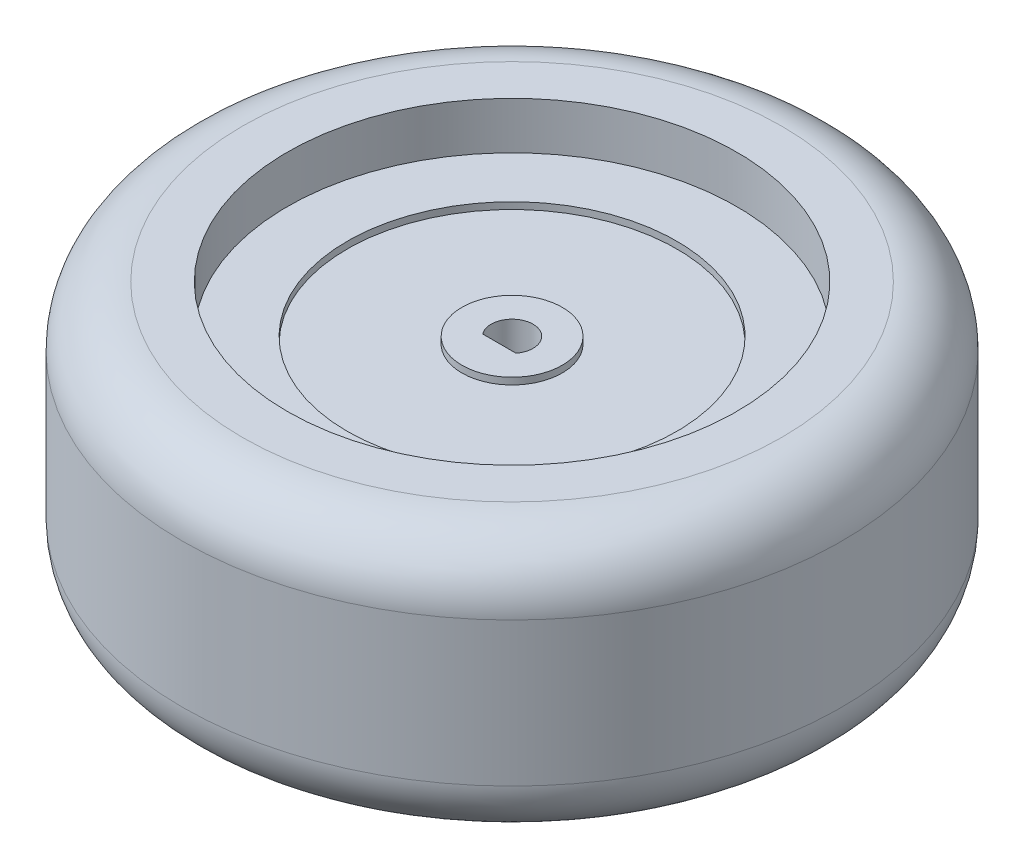
ISO-10303-21;
HEADER;
FILE_DESCRIPTION(('STEP AP214'),'2;1');
FILE_NAME('part.step','',(''),(''),'','','');
FILE_SCHEMA(('AUTOMOTIVE_DESIGN { 1 0 10303 214 1 1 1 1 }'));
ENDSEC;
DATA;
#1=APPLICATION_CONTEXT('core data for automotive mechanical design processes');
#2=APPLICATION_PROTOCOL_DEFINITION('international standard','automotive_design',2000,#1);
#3=PRODUCT_CONTEXT('',#1,'mechanical');
#4=PRODUCT('Part','Part','',(#3));
#5=PRODUCT_RELATED_PRODUCT_CATEGORY('part','',(#4));
#6=PRODUCT_DEFINITION_FORMATION('','',#4);
#7=PRODUCT_DEFINITION_CONTEXT('part definition',#1,'design');
#8=PRODUCT_DEFINITION('design','',#6,#7);
#9=PRODUCT_DEFINITION_SHAPE('','',#8);
#10=(LENGTH_UNIT() NAMED_UNIT(*) SI_UNIT(.MILLI.,.METRE.));
#11=(NAMED_UNIT(*) PLANE_ANGLE_UNIT() SI_UNIT($,.RADIAN.));
#12=(NAMED_UNIT(*) SI_UNIT($,.STERADIAN.) SOLID_ANGLE_UNIT());
#13=UNCERTAINTY_MEASURE_WITH_UNIT(LENGTH_MEASURE(1.E-05),#10,'distance_accuracy_value','');
#14=(GEOMETRIC_REPRESENTATION_CONTEXT(3) GLOBAL_UNCERTAINTY_ASSIGNED_CONTEXT((#13)) GLOBAL_UNIT_ASSIGNED_CONTEXT((#10,
#11,#12)) REPRESENTATION_CONTEXT('',''));
#15=CARTESIAN_POINT('',(0.,0.,0.));
#16=DIRECTION('',(0.,0.,1.));
#17=DIRECTION('',(1.,0.,0.));
#18=AXIS2_PLACEMENT_3D('',#15,#16,#17);
#19=CARTESIAN_POINT('',(0.,-23.18,0.85));
#20=DIRECTION('',(0.,0.,1.));
#21=DIRECTION('',(1.,0.,0.));
#22=AXIS2_PLACEMENT_3D('',#19,#20,#21);
#23=PLANE('',#22);
#24=DIRECTION('',(1.,0.,0.));
#25=VECTOR('',#24,1.);
#26=CARTESIAN_POINT('',(0.,9.,0.85));
#27=LINE('',#26,#25);
#28=CARTESIAN_POINT('',(-1.11242977306435,9.,0.85));
#29=VERTEX_POINT('',#28);
#30=CARTESIAN_POINT('',(1.11242977306435,9.,0.85));
#31=VERTEX_POINT('',#30);
#32=EDGE_CURVE('E60',#29,#31,#27,.T.);
#33=ORIENTED_EDGE('',*,*,#32,.F.);
#34=DIRECTION('',(0.,1.,0.));
#35=VECTOR('',#34,1.);
#36=CARTESIAN_POINT('',(-1.11242977306435,-23.18,0.85));
#37=LINE('',#36,#35);
#38=CARTESIAN_POINT('',(-1.11242977306435,14.45,0.85));
#39=VERTEX_POINT('',#38);
#40=EDGE_CURVE('E67',#29,#39,#37,.T.);
#41=ORIENTED_EDGE('',*,*,#40,.T.);
#42=DIRECTION('',(-1.,0.,0.));
#43=VECTOR('',#42,1.);
#44=CARTESIAN_POINT('',(0.,14.45,0.85));
#45=LINE('',#44,#43);
#46=CARTESIAN_POINT('',(1.11242977306435,14.45,0.85));
#47=VERTEX_POINT('',#46);
#48=EDGE_CURVE('E180',#47,#39,#45,.T.);
#49=ORIENTED_EDGE('',*,*,#48,.F.);
#50=DIRECTION('',(0.,1.,0.));
#51=VECTOR('',#50,1.);
#52=CARTESIAN_POINT('',(1.11242977306435,-23.18,0.85));
#53=LINE('',#52,#51);
#54=EDGE_CURVE('E80',#31,#47,#53,.T.);
#55=ORIENTED_EDGE('',*,*,#54,.F.);
#56=EDGE_LOOP('',(#33,#41,#49,#55));
#57=FACE_BOUND('',#56,.T.);
#58=ADVANCED_FACE('F46',(#57),#23,.F.);
#59=CARTESIAN_POINT('',(0.,-23.18,0.));
#60=DIRECTION('',(0.,1.,0.));
#61=DIRECTION('',(0.,0.,1.));
#62=AXIS2_PLACEMENT_3D('',#59,#60,#61);
#63=CYLINDRICAL_SURFACE('',#62,1.4);
#64=CARTESIAN_POINT('',(0.,9.,0.));
#65=DIRECTION('',(0.,-1.,0.));
#66=DIRECTION('',(0.,0.,-1.));
#67=AXIS2_PLACEMENT_3D('',#64,#65,#66);
#68=CIRCLE('',#67,1.4);
#69=EDGE_CURVE('E73',#31,#29,#68,.F.);
#70=ORIENTED_EDGE('',*,*,#69,.F.);
#71=ORIENTED_EDGE('',*,*,#54,.T.);
#72=CARTESIAN_POINT('',(0.,14.45,0.));
#73=DIRECTION('',(0.,1.,0.));
#74=DIRECTION('',(0.,0.,1.));
#75=AXIS2_PLACEMENT_3D('',#72,#73,#74);
#76=CIRCLE('',#75,1.4);
#77=EDGE_CURVE('E87',#47,#39,#76,.T.);
#78=ORIENTED_EDGE('',*,*,#77,.T.);
#79=ORIENTED_EDGE('',*,*,#40,.F.);
#80=EDGE_LOOP('',(#70,#71,#78,#79));
#81=FACE_BOUND('',#80,.T.);
#82=ADVANCED_FACE('F85',(#81),#63,.F.);
#83=CARTESIAN_POINT('',(0.,17.6,0.));
#84=DIRECTION('',(0.,-1.,0.));
#85=DIRECTION('',(0.,0.,-1.));
#86=AXIS2_PLACEMENT_3D('',#83,#84,#85);
#87=CYLINDRICAL_SURFACE('',#86,22.);
#88=CARTESIAN_POINT('',(0.,13.6,0.));
#89=DIRECTION('',(0.,1.,0.));
#90=DIRECTION('',(0.,0.,1.));
#91=AXIS2_PLACEMENT_3D('',#88,#89,#90);
#92=CIRCLE('',#91,22.);
#93=CARTESIAN_POINT('',(0.,13.6,22.));
#94=VERTEX_POINT('',#93);
#95=EDGE_CURVE('E54',#94,#94,#92,.F.);
#96=ORIENTED_EDGE('',*,*,#95,.T.);
#97=EDGE_LOOP('',(#96));
#98=FACE_BOUND('',#97,.T.);
#99=CARTESIAN_POINT('',(0.,4.,0.));
#100=DIRECTION('',(0.,1.,0.));
#101=DIRECTION('',(0.,0.,1.));
#102=AXIS2_PLACEMENT_3D('',#99,#100,#101);
#103=CIRCLE('',#102,22.);
#104=CARTESIAN_POINT('',(0.,4.,22.));
#105=VERTEX_POINT('',#104);
#106=EDGE_CURVE('E102',#105,#105,#103,.T.);
#107=ORIENTED_EDGE('',*,*,#106,.T.);
#108=EDGE_LOOP('',(#107));
#109=FACE_BOUND('',#108,.T.);
#110=ADVANCED_FACE('F107',(#98,#109),#87,.T.);
#111=CARTESIAN_POINT('',(0.,17.6,0.));
#112=DIRECTION('',(0.,1.,0.));
#113=DIRECTION('',(0.,0.,1.));
#114=AXIS2_PLACEMENT_3D('',#111,#112,#113);
#115=PLANE('',#114);
#116=CARTESIAN_POINT('',(0.,17.6,0.));
#117=DIRECTION('',(0.,1.,0.));
#118=DIRECTION('',(0.,0.,1.));
#119=AXIS2_PLACEMENT_3D('',#116,#117,#118);
#120=CIRCLE('',#119,18.);
#121=CARTESIAN_POINT('',(0.,17.6,18.));
#122=VERTEX_POINT('',#121);
#123=EDGE_CURVE('E77',#122,#122,#120,.T.);
#124=ORIENTED_EDGE('',*,*,#123,.T.);
#125=EDGE_LOOP('',(#124));
#126=FACE_BOUND('',#125,.T.);
#127=CARTESIAN_POINT('',(0.,17.6,0.));
#128=DIRECTION('',(0.,1.,0.));
#129=DIRECTION('',(0.,0.,1.));
#130=AXIS2_PLACEMENT_3D('',#127,#128,#129);
#131=CIRCLE('',#130,15.);
#132=CARTESIAN_POINT('',(0.,17.6,15.));
#133=VERTEX_POINT('',#132);
#134=EDGE_CURVE('E88',#133,#133,#131,.T.);
#135=ORIENTED_EDGE('',*,*,#134,.F.);
#136=EDGE_LOOP('',(#135));
#137=FACE_BOUND('',#136,.T.);
#138=ADVANCED_FACE('F116',(#126,#137),#115,.T.);
#139=CARTESIAN_POINT('',(0.,0.,0.));
#140=DIRECTION('',(0.,1.,0.));
#141=DIRECTION('',(0.,0.,1.));
#142=AXIS2_PLACEMENT_3D('',#139,#140,#141);
#143=PLANE('',#142);
#144=CARTESIAN_POINT('',(0.,0.,0.));
#145=DIRECTION('',(0.,1.,0.));
#146=DIRECTION('',(0.,0.,1.));
#147=AXIS2_PLACEMENT_3D('',#144,#145,#146);
#148=CIRCLE('',#147,18.);
#149=CARTESIAN_POINT('',(0.,0.,18.));
#150=VERTEX_POINT('',#149);
#151=EDGE_CURVE('E12',#150,#150,#148,.F.);
#152=ORIENTED_EDGE('',*,*,#151,.T.);
#153=EDGE_LOOP('',(#152));
#154=FACE_BOUND('',#153,.T.);
#155=CARTESIAN_POINT('',(0.,0.,0.));
#156=DIRECTION('',(0.,-1.,0.));
#157=DIRECTION('',(0.,0.,-1.));
#158=AXIS2_PLACEMENT_3D('',#155,#156,#157);
#159=CIRCLE('',#158,10.75);
#160=CARTESIAN_POINT('',(0.,0.,-10.75));
#161=VERTEX_POINT('',#160);
#162=EDGE_CURVE('E169',#161,#161,#159,.T.);
#163=ORIENTED_EDGE('',*,*,#162,.F.);
#164=EDGE_LOOP('',(#163));
#165=FACE_BOUND('',#164,.T.);
#166=ADVANCED_FACE('F119',(#154,#165),#143,.F.);
#167=CARTESIAN_POINT('',(0.,14.,0.));
#168=DIRECTION('',(0.,1.,0.));
#169=DIRECTION('',(0.,0.,1.));
#170=AXIS2_PLACEMENT_3D('',#167,#168,#169);
#171=CYLINDRICAL_SURFACE('',#170,15.);
#172=CARTESIAN_POINT('',(0.,14.45,0.));
#173=DIRECTION('',(0.,1.,0.));
#174=DIRECTION('',(0.,0.,1.));
#175=AXIS2_PLACEMENT_3D('',#172,#173,#174);
#176=CIRCLE('',#175,15.);
#177=CARTESIAN_POINT('',(0.,14.45,15.));
#178=VERTEX_POINT('',#177);
#179=EDGE_CURVE('E176',#178,#178,#176,.T.);
#180=ORIENTED_EDGE('',*,*,#179,.F.);
#181=EDGE_LOOP('',(#180));
#182=FACE_BOUND('',#181,.T.);
#183=ORIENTED_EDGE('',*,*,#134,.T.);
#184=EDGE_LOOP('',(#183));
#185=FACE_BOUND('',#184,.T.);
#186=ADVANCED_FACE('F123',(#182,#185),#171,.F.);
#187=CARTESIAN_POINT('',(0.,14.,0.));
#188=DIRECTION('',(0.,1.,0.));
#189=DIRECTION('',(0.,0.,1.));
#190=AXIS2_PLACEMENT_3D('',#187,#188,#189);
#191=PLANE('',#190);
#192=CARTESIAN_POINT('',(0.,14.,0.));
#193=DIRECTION('',(0.,1.,0.));
#194=DIRECTION('',(0.,0.,1.));
#195=AXIS2_PLACEMENT_3D('',#192,#193,#194);
#196=CIRCLE('',#195,11.);
#197=CARTESIAN_POINT('',(0.,14.,11.));
#198=VERTEX_POINT('',#197);
#199=EDGE_CURVE('E78',#198,#198,#196,.F.);
#200=ORIENTED_EDGE('',*,*,#199,.F.);
#201=EDGE_LOOP('',(#200));
#202=FACE_BOUND('',#201,.T.);
#203=CARTESIAN_POINT('',(0.,14.,0.));
#204=DIRECTION('',(0.,1.,0.));
#205=DIRECTION('',(0.,0.,1.));
#206=AXIS2_PLACEMENT_3D('',#203,#204,#205);
#207=CIRCLE('',#206,3.35);
#208=CARTESIAN_POINT('',(0.,14.,3.35));
#209=VERTEX_POINT('',#208);
#210=EDGE_CURVE('E95',#209,#209,#207,.T.);
#211=ORIENTED_EDGE('',*,*,#210,.F.);
#212=EDGE_LOOP('',(#211));
#213=FACE_BOUND('',#212,.T.);
#214=ADVANCED_FACE('F125',(#202,#213),#191,.T.);
#215=CARTESIAN_POINT('',(0.,14.45,0.));
#216=DIRECTION('',(0.,-1.,0.));
#217=DIRECTION('',(0.,0.,-1.));
#218=AXIS2_PLACEMENT_3D('',#215,#216,#217);
#219=CYLINDRICAL_SURFACE('',#218,3.35);
#220=CARTESIAN_POINT('',(0.,14.45,0.));
#221=DIRECTION('',(0.,1.,0.));
#222=DIRECTION('',(0.,0.,1.));
#223=AXIS2_PLACEMENT_3D('',#220,#221,#222);
#224=CIRCLE('',#223,3.35);
#225=CARTESIAN_POINT('',(0.,14.45,3.35));
#226=VERTEX_POINT('',#225);
#227=EDGE_CURVE('E92',#226,#226,#224,.T.);
#228=ORIENTED_EDGE('',*,*,#227,.F.);
#229=EDGE_LOOP('',(#228));
#230=FACE_BOUND('',#229,.T.);
#231=ORIENTED_EDGE('',*,*,#210,.T.);
#232=EDGE_LOOP('',(#231));
#233=FACE_BOUND('',#232,.T.);
#234=ADVANCED_FACE('F132',(#230,#233),#219,.T.);
#235=CARTESIAN_POINT('',(0.,14.45,0.));
#236=DIRECTION('',(0.,1.,0.));
#237=DIRECTION('',(0.,0.,1.));
#238=AXIS2_PLACEMENT_3D('',#235,#236,#237);
#239=PLANE('',#238);
#240=ORIENTED_EDGE('',*,*,#77,.F.);
#241=ORIENTED_EDGE('',*,*,#48,.T.);
#242=EDGE_LOOP('',(#240,#241));
#243=FACE_BOUND('',#242,.T.);
#244=ORIENTED_EDGE('',*,*,#227,.T.);
#245=EDGE_LOOP('',(#244));
#246=FACE_BOUND('',#245,.T.);
#247=ADVANCED_FACE('F147',(#243,#246),#239,.T.);
#248=CARTESIAN_POINT('',(0.,14.45,0.));
#249=DIRECTION('',(0.,-1.,0.));
#250=DIRECTION('',(0.,0.,-1.));
#251=AXIS2_PLACEMENT_3D('',#248,#249,#250);
#252=CYLINDRICAL_SURFACE('',#251,11.);
#253=CARTESIAN_POINT('',(0.,14.45,0.));
#254=DIRECTION('',(0.,1.,0.));
#255=DIRECTION('',(0.,0.,1.));
#256=AXIS2_PLACEMENT_3D('',#253,#254,#255);
#257=CIRCLE('',#256,11.);
#258=CARTESIAN_POINT('',(0.,14.45,11.));
#259=VERTEX_POINT('',#258);
#260=EDGE_CURVE('E81',#259,#259,#257,.T.);
#261=ORIENTED_EDGE('',*,*,#260,.T.);
#262=EDGE_LOOP('',(#261));
#263=FACE_BOUND('',#262,.T.);
#264=ORIENTED_EDGE('',*,*,#199,.T.);
#265=EDGE_LOOP('',(#264));
#266=FACE_BOUND('',#265,.T.);
#267=ADVANCED_FACE('F151',(#263,#266),#252,.F.);
#268=CARTESIAN_POINT('',(0.,14.45,0.));
#269=DIRECTION('',(0.,1.,0.));
#270=DIRECTION('',(0.,0.,1.));
#271=AXIS2_PLACEMENT_3D('',#268,#269,#270);
#272=PLANE('',#271);
#273=ORIENTED_EDGE('',*,*,#260,.F.);
#274=EDGE_LOOP('',(#273));
#275=FACE_BOUND('',#274,.T.);
#276=ORIENTED_EDGE('',*,*,#179,.T.);
#277=EDGE_LOOP('',(#276));
#278=FACE_BOUND('',#277,.T.);
#279=ADVANCED_FACE('F155',(#275,#278),#272,.T.);
#280=CARTESIAN_POINT('',(0.,9.,0.));
#281=DIRECTION('',(0.,-1.,0.));
#282=DIRECTION('',(0.,0.,-1.));
#283=AXIS2_PLACEMENT_3D('',#280,#281,#282);
#284=PLANE('',#283);
#285=CARTESIAN_POINT('',(0.,9.,0.));
#286=DIRECTION('',(0.,-1.,0.));
#287=DIRECTION('',(0.,0.,-1.));
#288=AXIS2_PLACEMENT_3D('',#285,#286,#287);
#289=CIRCLE('',#288,10.75);
#290=CARTESIAN_POINT('',(0.,9.,-10.75));
#291=VERTEX_POINT('',#290);
#292=EDGE_CURVE('E82',#291,#291,#289,.T.);
#293=ORIENTED_EDGE('',*,*,#292,.T.);
#294=EDGE_LOOP('',(#293));
#295=FACE_BOUND('',#294,.T.);
#296=ORIENTED_EDGE('',*,*,#32,.T.);
#297=ORIENTED_EDGE('',*,*,#69,.T.);
#298=EDGE_LOOP('',(#296,#297));
#299=FACE_BOUND('',#298,.T.);
#300=ADVANCED_FACE('F74',(#295,#299),#284,.T.);
#301=CARTESIAN_POINT('',(0.,9.,0.));
#302=DIRECTION('',(0.,-1.,0.));
#303=DIRECTION('',(0.,0.,-1.));
#304=AXIS2_PLACEMENT_3D('',#301,#302,#303);
#305=CYLINDRICAL_SURFACE('',#304,10.75);
#306=ORIENTED_EDGE('',*,*,#292,.F.);
#307=EDGE_LOOP('',(#306));
#308=FACE_BOUND('',#307,.T.);
#309=ORIENTED_EDGE('',*,*,#162,.T.);
#310=EDGE_LOOP('',(#309));
#311=FACE_BOUND('',#310,.T.);
#312=ADVANCED_FACE('F113',(#308,#311),#305,.F.);
#313=CARTESIAN_POINT('',(0.,13.6,0.));
#314=DIRECTION('',(0.,1.,0.));
#315=DIRECTION('',(0.,0.,1.));
#316=AXIS2_PLACEMENT_3D('',#313,#314,#315);
#317=TOROIDAL_SURFACE('',#316,18.,4.);
#318=ORIENTED_EDGE('',*,*,#95,.F.);
#319=EDGE_LOOP('',(#318));
#320=FACE_BOUND('',#319,.T.);
#321=ORIENTED_EDGE('',*,*,#123,.F.);
#322=EDGE_LOOP('',(#321));
#323=FACE_BOUND('',#322,.T.);
#324=ADVANCED_FACE('F110',(#320,#323),#317,.T.);
#325=CARTESIAN_POINT('',(0.,4.,0.));
#326=DIRECTION('',(0.,1.,0.));
#327=DIRECTION('',(0.,0.,1.));
#328=AXIS2_PLACEMENT_3D('',#325,#326,#327);
#329=TOROIDAL_SURFACE('',#328,18.,4.);
#330=ORIENTED_EDGE('',*,*,#151,.F.);
#331=EDGE_LOOP('',(#330));
#332=FACE_BOUND('',#331,.T.);
#333=ORIENTED_EDGE('',*,*,#106,.F.);
#334=EDGE_LOOP('',(#333));
#335=FACE_BOUND('',#334,.T.);
#336=ADVANCED_FACE('F48',(#332,#335),#329,.T.);
#337=CLOSED_SHELL('',(#58,#82,#110,#138,#166,#186,#214,#234,#247,#267,#279,#300,#312,#324,#336));
#338=MANIFOLD_SOLID_BREP('B2',#337);
#339=ADVANCED_BREP_SHAPE_REPRESENTATION('',(#18,#338),#14);
#340=SHAPE_DEFINITION_REPRESENTATION(#9,#339);
ENDSEC;
END-ISO-10303-21;
